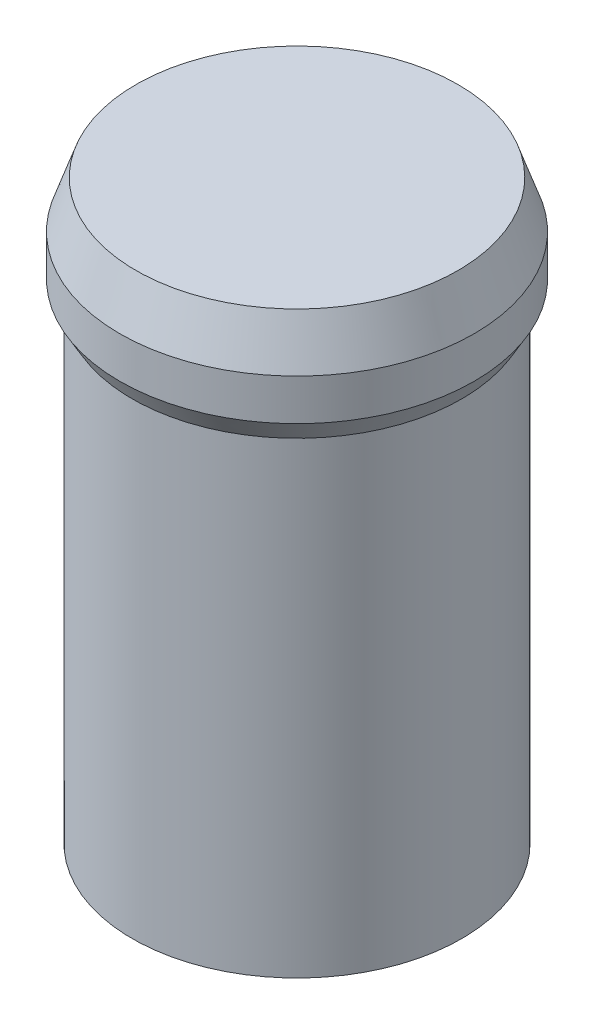
ISO-10303-21;
HEADER;
FILE_DESCRIPTION(('STEP AP214'),'2;1');
FILE_NAME('part.step','',(''),(''),'','','');
FILE_SCHEMA(('AUTOMOTIVE_DESIGN { 1 0 10303 214 1 1 1 1 }'));
ENDSEC;
DATA;
#1=APPLICATION_CONTEXT('core data for automotive mechanical design processes');
#2=APPLICATION_PROTOCOL_DEFINITION('international standard','automotive_design',2000,#1);
#3=PRODUCT_CONTEXT('',#1,'mechanical');
#4=PRODUCT('Part','Part','',(#3));
#5=PRODUCT_RELATED_PRODUCT_CATEGORY('part','',(#4));
#6=PRODUCT_DEFINITION_FORMATION('','',#4);
#7=PRODUCT_DEFINITION_CONTEXT('part definition',#1,'design');
#8=PRODUCT_DEFINITION('design','',#6,#7);
#9=PRODUCT_DEFINITION_SHAPE('','',#8);
#10=(LENGTH_UNIT() NAMED_UNIT(*) SI_UNIT(.MILLI.,.METRE.));
#11=(NAMED_UNIT(*) PLANE_ANGLE_UNIT() SI_UNIT($,.RADIAN.));
#12=(NAMED_UNIT(*) SI_UNIT($,.STERADIAN.) SOLID_ANGLE_UNIT());
#13=UNCERTAINTY_MEASURE_WITH_UNIT(LENGTH_MEASURE(1.E-05),#10,'distance_accuracy_value','');
#14=(GEOMETRIC_REPRESENTATION_CONTEXT(3) GLOBAL_UNCERTAINTY_ASSIGNED_CONTEXT((#13)) GLOBAL_UNIT_ASSIGNED_CONTEXT((#10,
#11,#12)) REPRESENTATION_CONTEXT('',''));
#15=CARTESIAN_POINT('',(0.,0.,0.));
#16=DIRECTION('',(0.,0.,1.));
#17=DIRECTION('',(1.,0.,0.));
#18=AXIS2_PLACEMENT_3D('',#15,#16,#17);
#19=CARTESIAN_POINT('',(20.,0.,0.));
#20=DIRECTION('',(0.,-1.,0.));
#21=DIRECTION('',(0.,0.,-1.));
#22=AXIS2_PLACEMENT_3D('',#19,#20,#21);
#23=PLANE('',#22);
#24=CARTESIAN_POINT('',(0.,0.,0.));
#25=DIRECTION('',(0.,-1.,0.));
#26=DIRECTION('',(0.,0.,-1.));
#27=AXIS2_PLACEMENT_3D('',#24,#25,#26);
#28=CIRCLE('',#27,20.);
#29=CARTESIAN_POINT('',(0.,0.,-20.));
#30=VERTEX_POINT('',#29);
#31=EDGE_CURVE('E81',#30,#30,#28,.T.);
#32=ORIENTED_EDGE('',*,*,#31,.T.);
#33=EDGE_LOOP('',(#32));
#34=FACE_BOUND('',#33,.T.);
#35=CARTESIAN_POINT('',(0.,0.,0.));
#36=DIRECTION('',(0.,-1.,0.));
#37=DIRECTION('',(0.,0.,-1.));
#38=AXIS2_PLACEMENT_3D('',#35,#36,#37);
#39=CIRCLE('',#38,19.);
#40=CARTESIAN_POINT('',(0.,0.,-19.));
#41=VERTEX_POINT('',#40);
#42=EDGE_CURVE('E54',#41,#41,#39,.T.);
#43=ORIENTED_EDGE('',*,*,#42,.F.);
#44=EDGE_LOOP('',(#43));
#45=FACE_BOUND('',#44,.T.);
#46=ADVANCED_FACE('F41',(#34,#45),#23,.T.);
#47=CARTESIAN_POINT('',(0.,2.4,0.));
#48=DIRECTION('',(0.,-1.,0.));
#49=DIRECTION('',(0.,0.,-1.));
#50=AXIS2_PLACEMENT_3D('',#47,#48,#49);
#51=CYLINDRICAL_SURFACE('',#50,19.);
#52=ORIENTED_EDGE('',*,*,#42,.T.);
#53=EDGE_LOOP('',(#52));
#54=FACE_BOUND('',#53,.T.);
#55=CARTESIAN_POINT('',(0.,1.15,0.));
#56=DIRECTION('',(0.,-1.,0.));
#57=DIRECTION('',(0.,0.,-1.));
#58=AXIS2_PLACEMENT_3D('',#55,#56,#57);
#59=CIRCLE('',#58,19.);
#60=CARTESIAN_POINT('',(0.,1.15,-19.));
#61=VERTEX_POINT('',#60);
#62=EDGE_CURVE('E59',#61,#61,#59,.T.);
#63=ORIENTED_EDGE('',*,*,#62,.F.);
#64=EDGE_LOOP('',(#63));
#65=FACE_BOUND('',#64,.T.);
#66=ADVANCED_FACE('F102',(#54,#65),#51,.F.);
#67=CARTESIAN_POINT('',(4.5,1.15,0.));
#68=DIRECTION('',(0.,-1.,0.));
#69=DIRECTION('',(0.,0.,-1.));
#70=AXIS2_PLACEMENT_3D('',#67,#68,#69);
#71=PLANE('',#70);
#72=CARTESIAN_POINT('',(0.,1.15,0.));
#73=DIRECTION('',(0.,-1.,0.));
#74=DIRECTION('',(0.,0.,-1.));
#75=AXIS2_PLACEMENT_3D('',#72,#73,#74);
#76=CIRCLE('',#75,6.);
#77=CARTESIAN_POINT('',(0.,1.15,-6.));
#78=VERTEX_POINT('',#77);
#79=EDGE_CURVE('E49',#78,#78,#76,.F.);
#80=ORIENTED_EDGE('',*,*,#79,.T.);
#81=EDGE_LOOP('',(#80));
#82=FACE_BOUND('',#81,.T.);
#83=ORIENTED_EDGE('',*,*,#62,.T.);
#84=EDGE_LOOP('',(#83));
#85=FACE_BOUND('',#84,.T.);
#86=ADVANCED_FACE('F106',(#82,#85),#71,.T.);
#87=CARTESIAN_POINT('',(4.5,2.4,0.));
#88=DIRECTION('',(0.,-1.,0.));
#89=DIRECTION('',(0.,0.,-1.));
#90=AXIS2_PLACEMENT_3D('',#87,#88,#89);
#91=PLANE('',#90);
#92=CARTESIAN_POINT('',(0.,2.4,0.));
#93=DIRECTION('',(0.,-1.,0.));
#94=DIRECTION('',(0.,0.,-1.));
#95=AXIS2_PLACEMENT_3D('',#92,#93,#94);
#96=CIRCLE('',#95,4.75);
#97=CARTESIAN_POINT('',(0.,2.4,-4.75));
#98=VERTEX_POINT('',#97);
#99=EDGE_CURVE('E12',#98,#98,#96,.T.);
#100=ORIENTED_EDGE('',*,*,#99,.T.);
#101=EDGE_LOOP('',(#100));
#102=FACE_BOUND('',#101,.T.);
#103=ADVANCED_FACE('F112',(#102),#91,.T.);
#104=CARTESIAN_POINT('',(19.5472629066576,69.9985359070053,0.));
#105=DIRECTION('',(0.,1.,0.));
#106=DIRECTION('',(0.,0.,1.));
#107=AXIS2_PLACEMENT_3D('',#104,#105,#106);
#108=PLANE('',#107);
#109=CARTESIAN_POINT('',(0.,69.9985359070053,0.));
#110=DIRECTION('',(0.,-1.,0.));
#111=DIRECTION('',(0.,0.,-1.));
#112=AXIS2_PLACEMENT_3D('',#109,#110,#111);
#113=CIRCLE('',#112,19.5472629066576);
#114=CARTESIAN_POINT('',(0.,69.9985359070053,-19.5472629066576));
#115=VERTEX_POINT('',#114);
#116=EDGE_CURVE('E65',#115,#115,#113,.T.);
#117=ORIENTED_EDGE('',*,*,#116,.F.);
#118=EDGE_LOOP('',(#117));
#119=FACE_BOUND('',#118,.T.);
#120=ADVANCED_FACE('F115',(#119),#108,.T.);
#121=CARTESIAN_POINT('',(0.,64.3251931671134,0.));
#122=DIRECTION('',(0.,-1.,0.));
#123=DIRECTION('',(0.,0.,-1.));
#124=AXIS2_PLACEMENT_3D('',#121,#122,#123);
#125=CONICAL_SURFACE('',#124,21.5,0.331494136143233);
#126=ORIENTED_EDGE('',*,*,#116,.T.);
#127=EDGE_LOOP('',(#126));
#128=FACE_BOUND('',#127,.T.);
#129=CARTESIAN_POINT('',(0.,64.3251931671134,0.));
#130=DIRECTION('',(0.,-1.,0.));
#131=DIRECTION('',(0.,0.,-1.));
#132=AXIS2_PLACEMENT_3D('',#129,#130,#131);
#133=CIRCLE('',#132,21.5);
#134=CARTESIAN_POINT('',(0.,64.3251931671134,-21.5));
#135=VERTEX_POINT('',#134);
#136=EDGE_CURVE('E69',#135,#135,#133,.T.);
#137=ORIENTED_EDGE('',*,*,#136,.F.);
#138=EDGE_LOOP('',(#137));
#139=FACE_BOUND('',#138,.T.);
#140=ADVANCED_FACE('F118',(#128,#139),#125,.T.);
#141=CARTESIAN_POINT('',(0.,2.4,0.));
#142=DIRECTION('',(0.,-1.,0.));
#143=DIRECTION('',(0.,0.,-1.));
#144=AXIS2_PLACEMENT_3D('',#141,#142,#143);
#145=CYLINDRICAL_SURFACE('',#144,21.5);
#146=ORIENTED_EDGE('',*,*,#136,.T.);
#147=EDGE_LOOP('',(#146));
#148=FACE_BOUND('',#147,.T.);
#149=CARTESIAN_POINT('',(0.,59.3251931671134,0.));
#150=DIRECTION('',(0.,-1.,0.));
#151=DIRECTION('',(0.,0.,-1.));
#152=AXIS2_PLACEMENT_3D('',#149,#150,#151);
#153=CIRCLE('',#152,21.5);
#154=CARTESIAN_POINT('',(0.,59.3251931671134,-21.5));
#155=VERTEX_POINT('',#154);
#156=EDGE_CURVE('E73',#155,#155,#153,.T.);
#157=ORIENTED_EDGE('',*,*,#156,.F.);
#158=EDGE_LOOP('',(#157));
#159=FACE_BOUND('',#158,.T.);
#160=ADVANCED_FACE('F98',(#148,#159),#145,.T.);
#161=CARTESIAN_POINT('',(0.,56.7271169557601,0.));
#162=DIRECTION('',(0.,1.,0.));
#163=DIRECTION('',(0.,0.,1.));
#164=AXIS2_PLACEMENT_3D('',#161,#162,#163);
#165=CONICAL_SURFACE('',#164,20.,0.523598775598301);
#166=ORIENTED_EDGE('',*,*,#156,.T.);
#167=EDGE_LOOP('',(#166));
#168=FACE_BOUND('',#167,.T.);
#169=CARTESIAN_POINT('',(0.,56.7271169557601,0.));
#170=DIRECTION('',(0.,-1.,0.));
#171=DIRECTION('',(0.,0.,-1.));
#172=AXIS2_PLACEMENT_3D('',#169,#170,#171);
#173=CIRCLE('',#172,20.);
#174=CARTESIAN_POINT('',(0.,56.7271169557601,-20.));
#175=VERTEX_POINT('',#174);
#176=EDGE_CURVE('E77',#175,#175,#173,.T.);
#177=ORIENTED_EDGE('',*,*,#176,.F.);
#178=EDGE_LOOP('',(#177));
#179=FACE_BOUND('',#178,.T.);
#180=ADVANCED_FACE('F90',(#168,#179),#165,.T.);
#181=CARTESIAN_POINT('',(0.,2.4,0.));
#182=DIRECTION('',(0.,-1.,0.));
#183=DIRECTION('',(0.,0.,-1.));
#184=AXIS2_PLACEMENT_3D('',#181,#182,#183);
#185=CYLINDRICAL_SURFACE('',#184,20.);
#186=ORIENTED_EDGE('',*,*,#176,.T.);
#187=EDGE_LOOP('',(#186));
#188=FACE_BOUND('',#187,.T.);
#189=ORIENTED_EDGE('',*,*,#31,.F.);
#190=EDGE_LOOP('',(#189));
#191=FACE_BOUND('',#190,.T.);
#192=ADVANCED_FACE('F88',(#188,#191),#185,.T.);
#193=CARTESIAN_POINT('',(0.,2.65,0.));
#194=DIRECTION('',(0.,-1.,0.));
#195=DIRECTION('',(0.,0.,-1.));
#196=AXIS2_PLACEMENT_3D('',#193,#194,#195);
#197=CONICAL_SURFACE('',#196,4.5,0.785398163397449);
#198=ORIENTED_EDGE('',*,*,#79,.F.);
#199=EDGE_LOOP('',(#198));
#200=FACE_BOUND('',#199,.T.);
#201=ORIENTED_EDGE('',*,*,#99,.F.);
#202=EDGE_LOOP('',(#201));
#203=FACE_BOUND('',#202,.T.);
#204=ADVANCED_FACE('F43',(#200,#203),#197,.F.);
#205=CLOSED_SHELL('',(#46,#66,#86,#103,#120,#140,#160,#180,#192,#204));
#206=MANIFOLD_SOLID_BREP('B2',#205);
#207=ADVANCED_BREP_SHAPE_REPRESENTATION('',(#18,#206),#14);
#208=SHAPE_DEFINITION_REPRESENTATION(#9,#207);
ENDSEC;
END-ISO-10303-21;
